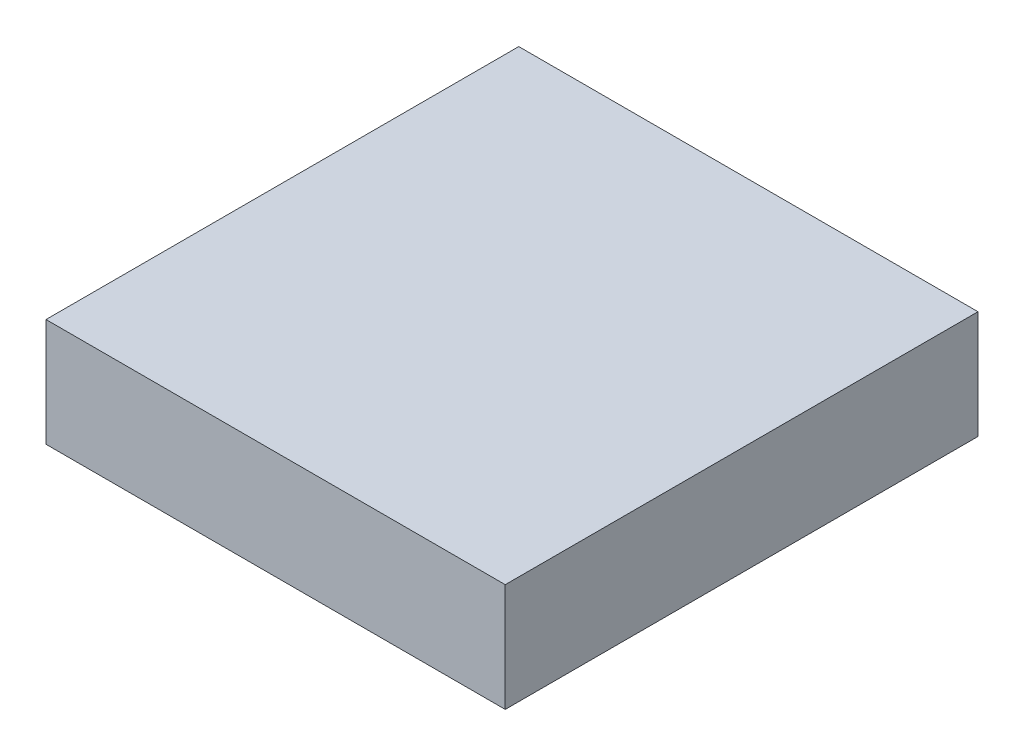
ISO-10303-21;
HEADER;
FILE_DESCRIPTION(('STEP AP214'),'2;1');
FILE_NAME('part.step','',(''),(''),'','','');
FILE_SCHEMA(('AUTOMOTIVE_DESIGN { 1 0 10303 214 1 1 1 1 }'));
ENDSEC;
DATA;
#1=APPLICATION_CONTEXT('core data for automotive mechanical design processes');
#2=APPLICATION_PROTOCOL_DEFINITION('international standard','automotive_design',2000,#1);
#3=PRODUCT_CONTEXT('',#1,'mechanical');
#4=PRODUCT('Part','Part','',(#3));
#5=PRODUCT_RELATED_PRODUCT_CATEGORY('part','',(#4));
#6=PRODUCT_DEFINITION_FORMATION('','',#4);
#7=PRODUCT_DEFINITION_CONTEXT('part definition',#1,'design');
#8=PRODUCT_DEFINITION('design','',#6,#7);
#9=PRODUCT_DEFINITION_SHAPE('','',#8);
#10=(LENGTH_UNIT() NAMED_UNIT(*) SI_UNIT(.MILLI.,.METRE.));
#11=(NAMED_UNIT(*) PLANE_ANGLE_UNIT() SI_UNIT($,.RADIAN.));
#12=(NAMED_UNIT(*) SI_UNIT($,.STERADIAN.) SOLID_ANGLE_UNIT());
#13=UNCERTAINTY_MEASURE_WITH_UNIT(LENGTH_MEASURE(1.E-05),#10,'distance_accuracy_value','');
#14=(GEOMETRIC_REPRESENTATION_CONTEXT(3) GLOBAL_UNCERTAINTY_ASSIGNED_CONTEXT((#13)) GLOBAL_UNIT_ASSIGNED_CONTEXT((#10,
#11,#12)) REPRESENTATION_CONTEXT('',''));
#15=CARTESIAN_POINT('',(0.,0.,0.));
#16=DIRECTION('',(0.,0.,1.));
#17=DIRECTION('',(1.,0.,0.));
#18=AXIS2_PLACEMENT_3D('',#15,#16,#17);
#19=CARTESIAN_POINT('',(43.18,20.32,-44.45));
#20=DIRECTION('',(-1.,0.,0.));
#21=DIRECTION('',(0.,0.,1.));
#22=AXIS2_PLACEMENT_3D('',#19,#20,#21);
#23=PLANE('',#22);
#24=DIRECTION('',(0.,0.,-1.));
#25=VECTOR('',#24,1.);
#26=CARTESIAN_POINT('',(43.18,0.,-44.45));
#27=LINE('',#26,#25);
#28=CARTESIAN_POINT('',(43.18,0.,44.45));
#29=VERTEX_POINT('',#28);
#30=CARTESIAN_POINT('',(43.18,0.,-44.45));
#31=VERTEX_POINT('',#30);
#32=EDGE_CURVE('E97',#29,#31,#27,.T.);
#33=ORIENTED_EDGE('',*,*,#32,.T.);
#34=DIRECTION('',(0.,-1.,0.));
#35=VECTOR('',#34,1.);
#36=CARTESIAN_POINT('',(43.18,20.32,-44.45));
#37=LINE('',#36,#35);
#38=CARTESIAN_POINT('',(43.18,20.32,-44.45));
#39=VERTEX_POINT('',#38);
#40=EDGE_CURVE('E11',#39,#31,#37,.T.);
#41=ORIENTED_EDGE('',*,*,#40,.F.);
#42=DIRECTION('',(0.,0.,-1.));
#43=VECTOR('',#42,1.);
#44=CARTESIAN_POINT('',(43.18,20.32,-44.45));
#45=LINE('',#44,#43);
#46=CARTESIAN_POINT('',(43.18,20.32,44.45));
#47=VERTEX_POINT('',#46);
#48=EDGE_CURVE('E85',#47,#39,#45,.T.);
#49=ORIENTED_EDGE('',*,*,#48,.F.);
#50=DIRECTION('',(0.,-1.,0.));
#51=VECTOR('',#50,1.);
#52=CARTESIAN_POINT('',(43.18,20.32,44.45));
#53=LINE('',#52,#51);
#54=EDGE_CURVE('E93',#47,#29,#53,.T.);
#55=ORIENTED_EDGE('',*,*,#54,.T.);
#56=EDGE_LOOP('',(#33,#41,#49,#55));
#57=FACE_BOUND('',#56,.T.);
#58=ADVANCED_FACE('F34',(#57),#23,.F.);
#59=CARTESIAN_POINT('',(-43.18,20.32,-44.45));
#60=DIRECTION('',(0.,0.,1.));
#61=DIRECTION('',(1.,0.,0.));
#62=AXIS2_PLACEMENT_3D('',#59,#60,#61);
#63=PLANE('',#62);
#64=DIRECTION('',(-1.,0.,0.));
#65=VECTOR('',#64,1.);
#66=CARTESIAN_POINT('',(-43.18,0.,-44.45));
#67=LINE('',#66,#65);
#68=CARTESIAN_POINT('',(-43.18,0.,-44.45));
#69=VERTEX_POINT('',#68);
#70=EDGE_CURVE('E89',#31,#69,#67,.T.);
#71=ORIENTED_EDGE('',*,*,#70,.T.);
#72=DIRECTION('',(0.,-1.,0.));
#73=VECTOR('',#72,1.);
#74=CARTESIAN_POINT('',(-43.18,20.32,-44.45));
#75=LINE('',#74,#73);
#76=CARTESIAN_POINT('',(-43.18,20.32,-44.45));
#77=VERTEX_POINT('',#76);
#78=EDGE_CURVE('E42',#77,#69,#75,.T.);
#79=ORIENTED_EDGE('',*,*,#78,.F.);
#80=DIRECTION('',(-1.,0.,0.));
#81=VECTOR('',#80,1.);
#82=CARTESIAN_POINT('',(-43.18,20.32,-44.45));
#83=LINE('',#82,#81);
#84=EDGE_CURVE('E80',#39,#77,#83,.T.);
#85=ORIENTED_EDGE('',*,*,#84,.F.);
#86=ORIENTED_EDGE('',*,*,#40,.T.);
#87=EDGE_LOOP('',(#71,#79,#85,#86));
#88=FACE_BOUND('',#87,.T.);
#89=ADVANCED_FACE('F88',(#88),#63,.F.);
#90=CARTESIAN_POINT('',(-43.18,20.32,-44.45));
#91=DIRECTION('',(1.,0.,0.));
#92=DIRECTION('',(0.,0.,-1.));
#93=AXIS2_PLACEMENT_3D('',#90,#91,#92);
#94=PLANE('',#93);
#95=DIRECTION('',(0.,0.,1.));
#96=VECTOR('',#95,1.);
#97=CARTESIAN_POINT('',(-43.18,0.,-44.45));
#98=LINE('',#97,#96);
#99=CARTESIAN_POINT('',(-43.18,0.,44.45));
#100=VERTEX_POINT('',#99);
#101=EDGE_CURVE('E67',#69,#100,#98,.T.);
#102=ORIENTED_EDGE('',*,*,#101,.T.);
#103=DIRECTION('',(0.,-1.,0.));
#104=VECTOR('',#103,1.);
#105=CARTESIAN_POINT('',(-43.18,20.32,44.45));
#106=LINE('',#105,#104);
#107=CARTESIAN_POINT('',(-43.18,20.32,44.45));
#108=VERTEX_POINT('',#107);
#109=EDGE_CURVE('E90',#108,#100,#106,.T.);
#110=ORIENTED_EDGE('',*,*,#109,.F.);
#111=DIRECTION('',(0.,0.,1.));
#112=VECTOR('',#111,1.);
#113=CARTESIAN_POINT('',(-43.18,20.32,-44.45));
#114=LINE('',#113,#112);
#115=EDGE_CURVE('E83',#77,#108,#114,.T.);
#116=ORIENTED_EDGE('',*,*,#115,.F.);
#117=ORIENTED_EDGE('',*,*,#78,.T.);
#118=EDGE_LOOP('',(#102,#110,#116,#117));
#119=FACE_BOUND('',#118,.T.);
#120=ADVANCED_FACE('F91',(#119),#94,.F.);
#121=CARTESIAN_POINT('',(-43.18,20.32,44.45));
#122=DIRECTION('',(0.,0.,-1.));
#123=DIRECTION('',(-1.,0.,0.));
#124=AXIS2_PLACEMENT_3D('',#121,#122,#123);
#125=PLANE('',#124);
#126=DIRECTION('',(1.,0.,0.));
#127=VECTOR('',#126,1.);
#128=CARTESIAN_POINT('',(-43.18,0.,44.45));
#129=LINE('',#128,#127);
#130=EDGE_CURVE('E73',#100,#29,#129,.T.);
#131=ORIENTED_EDGE('',*,*,#130,.T.);
#132=ORIENTED_EDGE('',*,*,#54,.F.);
#133=DIRECTION('',(1.,0.,0.));
#134=VECTOR('',#133,1.);
#135=CARTESIAN_POINT('',(-43.18,20.32,44.45));
#136=LINE('',#135,#134);
#137=EDGE_CURVE('E50',#108,#47,#136,.T.);
#138=ORIENTED_EDGE('',*,*,#137,.F.);
#139=ORIENTED_EDGE('',*,*,#109,.T.);
#140=EDGE_LOOP('',(#131,#132,#138,#139));
#141=FACE_BOUND('',#140,.T.);
#142=ADVANCED_FACE('F104',(#141),#125,.F.);
#143=CARTESIAN_POINT('',(0.,20.32,0.));
#144=DIRECTION('',(0.,1.,0.));
#145=DIRECTION('',(0.,0.,1.));
#146=AXIS2_PLACEMENT_3D('',#143,#144,#145);
#147=PLANE('',#146);
#148=ORIENTED_EDGE('',*,*,#48,.T.);
#149=ORIENTED_EDGE('',*,*,#84,.T.);
#150=ORIENTED_EDGE('',*,*,#115,.T.);
#151=ORIENTED_EDGE('',*,*,#137,.T.);
#152=EDGE_LOOP('',(#148,#149,#150,#151));
#153=FACE_BOUND('',#152,.T.);
#154=ADVANCED_FACE('F81',(#153),#147,.T.);
#155=CARTESIAN_POINT('',(0.,0.,0.));
#156=DIRECTION('',(0.,1.,0.));
#157=DIRECTION('',(0.,0.,1.));
#158=AXIS2_PLACEMENT_3D('',#155,#156,#157);
#159=PLANE('',#158);
#160=ORIENTED_EDGE('',*,*,#32,.F.);
#161=ORIENTED_EDGE('',*,*,#130,.F.);
#162=ORIENTED_EDGE('',*,*,#101,.F.);
#163=ORIENTED_EDGE('',*,*,#70,.F.);
#164=EDGE_LOOP('',(#160,#161,#162,#163));
#165=FACE_BOUND('',#164,.T.);
#166=ADVANCED_FACE('F107',(#165),#159,.F.);
#167=CLOSED_SHELL('',(#58,#89,#120,#142,#154,#166));
#168=MANIFOLD_SOLID_BREP('B2',#167);
#169=ADVANCED_BREP_SHAPE_REPRESENTATION('',(#18,#168),#14);
#170=SHAPE_DEFINITION_REPRESENTATION(#9,#169);
ENDSEC;
END-ISO-10303-21;
